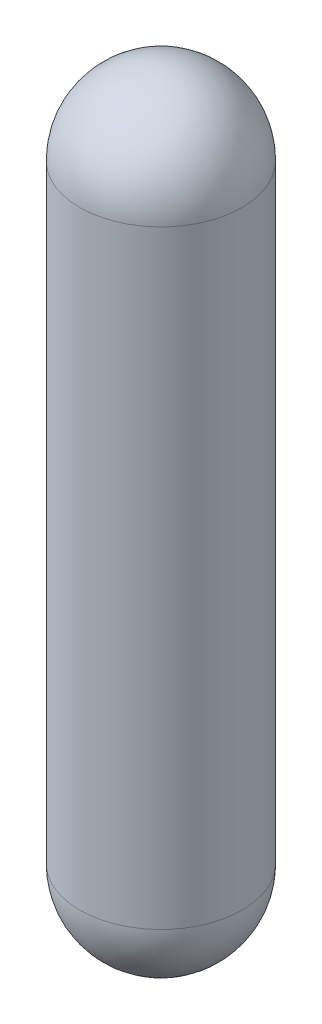
ISO-10303-21;
HEADER;
FILE_DESCRIPTION(('STEP AP214'),'2;1');
FILE_NAME('part.step','',(''),(''),'','','');
FILE_SCHEMA(('AUTOMOTIVE_DESIGN { 1 0 10303 214 1 1 1 1 }'));
ENDSEC;
DATA;
#1=APPLICATION_CONTEXT('core data for automotive mechanical design processes');
#2=APPLICATION_PROTOCOL_DEFINITION('international standard','automotive_design',2000,#1);
#3=PRODUCT_CONTEXT('',#1,'mechanical');
#4=PRODUCT('Part','Part','',(#3));
#5=PRODUCT_RELATED_PRODUCT_CATEGORY('part','',(#4));
#6=PRODUCT_DEFINITION_FORMATION('','',#4);
#7=PRODUCT_DEFINITION_CONTEXT('part definition',#1,'design');
#8=PRODUCT_DEFINITION('design','',#6,#7);
#9=PRODUCT_DEFINITION_SHAPE('','',#8);
#10=(LENGTH_UNIT() NAMED_UNIT(*) SI_UNIT(.MILLI.,.METRE.));
#11=(NAMED_UNIT(*) PLANE_ANGLE_UNIT() SI_UNIT($,.RADIAN.));
#12=(NAMED_UNIT(*) SI_UNIT($,.STERADIAN.) SOLID_ANGLE_UNIT());
#13=UNCERTAINTY_MEASURE_WITH_UNIT(LENGTH_MEASURE(1.E-05),#10,'distance_accuracy_value','');
#14=(GEOMETRIC_REPRESENTATION_CONTEXT(3) GLOBAL_UNCERTAINTY_ASSIGNED_CONTEXT((#13)) GLOBAL_UNIT_ASSIGNED_CONTEXT((#10,
#11,#12)) REPRESENTATION_CONTEXT('',''));
#15=CARTESIAN_POINT('',(0.,0.,0.));
#16=DIRECTION('',(0.,0.,1.));
#17=DIRECTION('',(1.,0.,0.));
#18=AXIS2_PLACEMENT_3D('',#15,#16,#17);
#19=CARTESIAN_POINT('',(0.,75.,0.));
#20=DIRECTION('',(0.,-1.,0.));
#21=DIRECTION('',(0.,0.,-1.));
#22=AXIS2_PLACEMENT_3D('',#19,#20,#21);
#23=CYLINDRICAL_SURFACE('',#22,10.);
#24=CARTESIAN_POINT('',(0.,75.,0.));
#25=DIRECTION('',(0.,1.,0.));
#26=DIRECTION('',(0.,0.,1.));
#27=AXIS2_PLACEMENT_3D('',#24,#25,#26);
#28=CIRCLE('',#27,10.);
#29=CARTESIAN_POINT('',(0.,75.,10.));
#30=VERTEX_POINT('',#29);
#31=EDGE_CURVE('E10',#30,#30,#28,.T.);
#32=ORIENTED_EDGE('',*,*,#31,.F.);
#33=EDGE_LOOP('',(#32));
#34=FACE_BOUND('',#33,.T.);
#35=CARTESIAN_POINT('',(0.,0.,0.));
#36=DIRECTION('',(0.,1.,0.));
#37=DIRECTION('',(0.,0.,1.));
#38=AXIS2_PLACEMENT_3D('',#35,#36,#37);
#39=CIRCLE('',#38,10.);
#40=CARTESIAN_POINT('',(0.,0.,10.));
#41=VERTEX_POINT('',#40);
#42=EDGE_CURVE('E35',#41,#41,#39,.T.);
#43=ORIENTED_EDGE('',*,*,#42,.T.);
#44=EDGE_LOOP('',(#43));
#45=FACE_BOUND('',#44,.T.);
#46=ADVANCED_FACE('F31',(#34,#45),#23,.T.);
#47=CARTESIAN_POINT('',(0.,75.,0.));
#48=DIRECTION('',(0.,0.,1.));
#49=DIRECTION('',(1.,0.,0.));
#50=AXIS2_PLACEMENT_3D('',#47,#48,#49);
#51=SPHERICAL_SURFACE('',#50,10.);
#52=CARTESIAN_POINT('',(0.,75.,0.));
#53=DIRECTION('',(0.,1.,0.));
#54=DIRECTION('',(0.,0.,1.));
#55=AXIS2_PLACEMENT_3D('',#52,#53,#54);
#56=SPHERICAL_SURFACE('',#55,10.);
#57=ORIENTED_EDGE('',*,*,#31,.T.);
#58=EDGE_LOOP('',(#57));
#59=FACE_BOUND('',#58,.T.);
#60=ADVANCED_FACE('F46',(#59),#56,.T.);
#61=CARTESIAN_POINT('',(0.,0.,0.));
#62=DIRECTION('',(0.,0.,1.));
#63=DIRECTION('',(1.,0.,0.));
#64=AXIS2_PLACEMENT_3D('',#61,#62,#63);
#65=SPHERICAL_SURFACE('',#64,10.);
#66=CARTESIAN_POINT('',(0.,0.,0.));
#67=DIRECTION('',(0.,1.,0.));
#68=DIRECTION('',(0.,0.,1.));
#69=AXIS2_PLACEMENT_3D('',#66,#67,#68);
#70=SPHERICAL_SURFACE('',#69,10.);
#71=ORIENTED_EDGE('',*,*,#42,.F.);
#72=EDGE_LOOP('',(#71));
#73=FACE_BOUND('',#72,.T.);
#74=ADVANCED_FACE('F33',(#73),#70,.T.);
#75=CLOSED_SHELL('',(#46,#60,#74));
#76=MANIFOLD_SOLID_BREP('B2',#75);
#77=ADVANCED_BREP_SHAPE_REPRESENTATION('',(#18,#76),#14);
#78=SHAPE_DEFINITION_REPRESENTATION(#9,#77);
ENDSEC;
END-ISO-10303-21;
